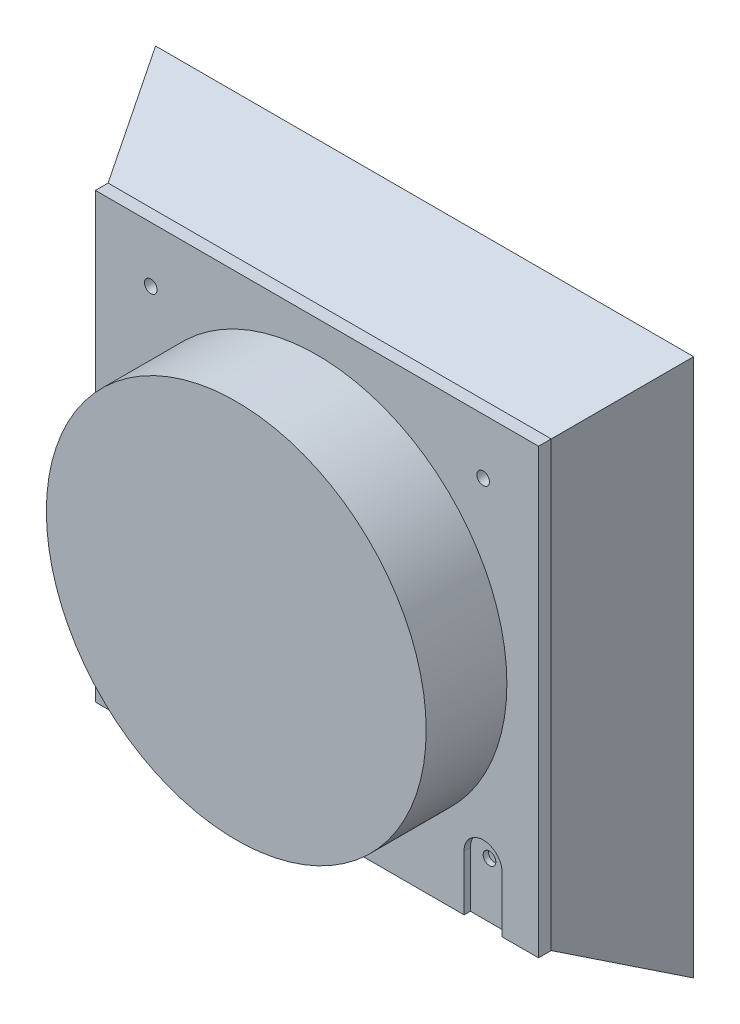
ISO-10303-21;
HEADER;
FILE_DESCRIPTION(('STEP AP214'),'2;1');
FILE_NAME('part.step','',(''),(''),'','','');
FILE_SCHEMA(('AUTOMOTIVE_DESIGN { 1 0 10303 214 1 1 1 1 }'));
ENDSEC;
DATA;
#1=APPLICATION_CONTEXT('core data for automotive mechanical design processes');
#2=APPLICATION_PROTOCOL_DEFINITION('international standard','automotive_design',2000,#1);
#3=PRODUCT_CONTEXT('',#1,'mechanical');
#4=PRODUCT('Part','Part','',(#3));
#5=PRODUCT_RELATED_PRODUCT_CATEGORY('part','',(#4));
#6=PRODUCT_DEFINITION_FORMATION('','',#4);
#7=PRODUCT_DEFINITION_CONTEXT('part definition',#1,'design');
#8=PRODUCT_DEFINITION('design','',#6,#7);
#9=PRODUCT_DEFINITION_SHAPE('','',#8);
#10=(LENGTH_UNIT() NAMED_UNIT(*) SI_UNIT(.MILLI.,.METRE.));
#11=(NAMED_UNIT(*) PLANE_ANGLE_UNIT() SI_UNIT($,.RADIAN.));
#12=(NAMED_UNIT(*) SI_UNIT($,.STERADIAN.) SOLID_ANGLE_UNIT());
#13=UNCERTAINTY_MEASURE_WITH_UNIT(LENGTH_MEASURE(1.E-05),#10,'distance_accuracy_value','');
#14=(GEOMETRIC_REPRESENTATION_CONTEXT(3) GLOBAL_UNCERTAINTY_ASSIGNED_CONTEXT((#13)) GLOBAL_UNIT_ASSIGNED_CONTEXT((#10,
#11,#12)) REPRESENTATION_CONTEXT('',''));
#15=CARTESIAN_POINT('',(0.,0.,0.));
#16=DIRECTION('',(0.,0.,1.));
#17=DIRECTION('',(1.,0.,0.));
#18=AXIS2_PLACEMENT_3D('',#15,#16,#17);
#19=CARTESIAN_POINT('',(0.,0.,29.5));
#20=DIRECTION('',(0.,0.,-1.));
#21=DIRECTION('',(-1.,0.,0.));
#22=AXIS2_PLACEMENT_3D('',#19,#20,#21);
#23=CYLINDRICAL_SURFACE('',#22,60.);
#24=CARTESIAN_POINT('',(0.,0.,29.5));
#25=DIRECTION('',(0.,0.,1.));
#26=DIRECTION('',(1.,0.,0.));
#27=AXIS2_PLACEMENT_3D('',#24,#25,#26);
#28=CIRCLE('',#27,60.);
#29=CARTESIAN_POINT('',(60.,0.,29.5));
#30=VERTEX_POINT('',#29);
#31=EDGE_CURVE('E12',#30,#30,#28,.T.);
#32=ORIENTED_EDGE('',*,*,#31,.F.);
#33=EDGE_LOOP('',(#32));
#34=FACE_BOUND('',#33,.T.);
#35=CARTESIAN_POINT('',(0.,0.,4.));
#36=DIRECTION('',(0.,0.,1.));
#37=DIRECTION('',(1.,0.,0.));
#38=AXIS2_PLACEMENT_3D('',#35,#36,#37);
#39=CIRCLE('',#38,60.);
#40=CARTESIAN_POINT('',(60.,0.,4.));
#41=VERTEX_POINT('',#40);
#42=EDGE_CURVE('E59',#41,#41,#39,.T.);
#43=ORIENTED_EDGE('',*,*,#42,.T.);
#44=EDGE_LOOP('',(#43));
#45=FACE_BOUND('',#44,.T.);
#46=ADVANCED_FACE('F56',(#34,#45),#23,.T.);
#47=CARTESIAN_POINT('',(0.,0.,29.5));
#48=DIRECTION('',(0.,0.,1.));
#49=DIRECTION('',(1.,0.,0.));
#50=AXIS2_PLACEMENT_3D('',#47,#48,#49);
#51=PLANE('',#50);
#52=ORIENTED_EDGE('',*,*,#31,.T.);
#53=EDGE_LOOP('',(#52));
#54=FACE_BOUND('',#53,.T.);
#55=ADVANCED_FACE('F71',(#54),#51,.T.);
#56=CARTESIAN_POINT('',(0.,0.,4.));
#57=DIRECTION('',(0.,0.,1.));
#58=DIRECTION('',(1.,0.,0.));
#59=AXIS2_PLACEMENT_3D('',#56,#57,#58);
#60=PLANE('',#59);
#61=ORIENTED_EDGE('',*,*,#42,.F.);
#62=EDGE_LOOP('',(#61));
#63=FACE_BOUND('',#62,.T.);
#64=ADVANCED_FACE('F69',(#63),#60,.F.);
#65=CLOSED_SHELL('',(#46,#55,#64));
#66=MANIFOLD_SOLID_BREP('B2_NOT_SHOWN',#65);
#67=CARTESIAN_POINT('',(-52.5,-52.5,4.));
#68=DIRECTION('',(0.,0.,-1.));
#69=DIRECTION('',(-1.,0.,0.));
#70=AXIS2_PLACEMENT_3D('',#67,#68,#69);
#71=CYLINDRICAL_SURFACE('',#70,1.99999999999993);
#72=CARTESIAN_POINT('',(-52.5,-52.5,2.));
#73=DIRECTION('',(0.,0.,1.));
#74=DIRECTION('',(1.,0.,0.));
#75=AXIS2_PLACEMENT_3D('',#72,#73,#74);
#76=CIRCLE('',#75,1.99999999999993);
#77=CARTESIAN_POINT('',(-50.5000000000001,-52.5,2.));
#78=VERTEX_POINT('',#77);
#79=EDGE_CURVE('E514',#78,#78,#76,.T.);
#80=ORIENTED_EDGE('',*,*,#79,.T.);
#81=EDGE_LOOP('',(#80));
#82=FACE_BOUND('',#81,.T.);
#83=CARTESIAN_POINT('',(-52.5,-52.5,0.333333333333333));
#84=DIRECTION('',(0.,0.,-1.));
#85=DIRECTION('',(-1.,0.,0.));
#86=AXIS2_PLACEMENT_3D('',#83,#84,#85);
#87=CIRCLE('',#86,1.99999999999993);
#88=CARTESIAN_POINT('',(-54.4999999999999,-52.5,0.333333333333333));
#89=VERTEX_POINT('',#88);
#90=EDGE_CURVE('E101',#89,#89,#87,.T.);
#91=ORIENTED_EDGE('',*,*,#90,.T.);
#92=EDGE_LOOP('',(#91));
#93=FACE_BOUND('',#92,.T.);
#94=ADVANCED_FACE('F97',(#82,#93),#71,.F.);
#95=CARTESIAN_POINT('',(52.5,52.5,4.));
#96=DIRECTION('',(0.,0.,-1.));
#97=DIRECTION('',(-1.,0.,0.));
#98=AXIS2_PLACEMENT_3D('',#95,#96,#97);
#99=CYLINDRICAL_SURFACE('',#98,2.);
#100=CARTESIAN_POINT('',(52.5,52.5,4.));
#101=DIRECTION('',(0.,0.,1.));
#102=DIRECTION('',(1.,0.,0.));
#103=AXIS2_PLACEMENT_3D('',#100,#101,#102);
#104=CIRCLE('',#103,2.);
#105=CARTESIAN_POINT('',(54.5,52.5,4.));
#106=VERTEX_POINT('',#105);
#107=EDGE_CURVE('E510',#106,#106,#104,.T.);
#108=ORIENTED_EDGE('',*,*,#107,.T.);
#109=EDGE_LOOP('',(#108));
#110=FACE_BOUND('',#109,.T.);
#111=CARTESIAN_POINT('',(52.5,52.5,0.333333333333333));
#112=DIRECTION('',(0.,0.,-1.));
#113=DIRECTION('',(-1.,0.,0.));
#114=AXIS2_PLACEMENT_3D('',#111,#112,#113);
#115=CIRCLE('',#114,2.);
#116=CARTESIAN_POINT('',(50.5,52.5,0.333333333333333));
#117=VERTEX_POINT('',#116);
#118=EDGE_CURVE('E525',#117,#117,#115,.T.);
#119=ORIENTED_EDGE('',*,*,#118,.T.);
#120=EDGE_LOOP('',(#119));
#121=FACE_BOUND('',#120,.T.);
#122=ADVANCED_FACE('F618',(#110,#121),#99,.F.);
#123=CARTESIAN_POINT('',(-52.5,52.5,4.));
#124=DIRECTION('',(0.,0.,-1.));
#125=DIRECTION('',(-1.,0.,0.));
#126=AXIS2_PLACEMENT_3D('',#123,#124,#125);
#127=CYLINDRICAL_SURFACE('',#126,1.99999999999995);
#128=CARTESIAN_POINT('',(-52.5,52.5,4.));
#129=DIRECTION('',(0.,0.,1.));
#130=DIRECTION('',(-1.,0.,0.));
#131=AXIS2_PLACEMENT_3D('',#128,#129,#130);
#132=CIRCLE('',#131,1.99999999999995);
#133=CARTESIAN_POINT('',(-54.5,52.5,4.));
#134=VERTEX_POINT('',#133);
#135=EDGE_CURVE('E397',#134,#134,#132,.T.);
#136=ORIENTED_EDGE('',*,*,#135,.T.);
#137=EDGE_LOOP('',(#136));
#138=FACE_BOUND('',#137,.T.);
#139=CARTESIAN_POINT('',(-52.5,52.5,0.333333333333333));
#140=DIRECTION('',(0.,0.,-1.));
#141=DIRECTION('',(-1.,0.,0.));
#142=AXIS2_PLACEMENT_3D('',#139,#140,#141);
#143=CIRCLE('',#142,1.99999999999995);
#144=CARTESIAN_POINT('',(-54.5,52.5,0.333333333333333));
#145=VERTEX_POINT('',#144);
#146=EDGE_CURVE('E522',#145,#145,#143,.T.);
#147=ORIENTED_EDGE('',*,*,#146,.T.);
#148=EDGE_LOOP('',(#147));
#149=FACE_BOUND('',#148,.T.);
#150=ADVANCED_FACE('F603',(#138,#149),#127,.F.);
#151=CARTESIAN_POINT('',(52.5,-52.5,4.));
#152=DIRECTION('',(0.,0.,-1.));
#153=DIRECTION('',(-1.,0.,0.));
#154=AXIS2_PLACEMENT_3D('',#151,#152,#153);
#155=CYLINDRICAL_SURFACE('',#154,1.99999999999999);
#156=CARTESIAN_POINT('',(52.5,-52.5,2.));
#157=DIRECTION('',(0.,0.,-1.));
#158=DIRECTION('',(-1.,0.,0.));
#159=AXIS2_PLACEMENT_3D('',#156,#157,#158);
#160=CIRCLE('',#159,1.99999999999999);
#161=CARTESIAN_POINT('',(50.5,-52.5,2.));
#162=VERTEX_POINT('',#161);
#163=EDGE_CURVE('E341',#162,#162,#160,.T.);
#164=ORIENTED_EDGE('',*,*,#163,.F.);
#165=EDGE_LOOP('',(#164));
#166=FACE_BOUND('',#165,.T.);
#167=CARTESIAN_POINT('',(52.5,-52.5,0.333333333333333));
#168=DIRECTION('',(0.,0.,-1.));
#169=DIRECTION('',(-1.,0.,0.));
#170=AXIS2_PLACEMENT_3D('',#167,#168,#169);
#171=CIRCLE('',#170,1.99999999999999);
#172=CARTESIAN_POINT('',(50.5,-52.5,0.333333333333333));
#173=VERTEX_POINT('',#172);
#174=EDGE_CURVE('E519',#173,#173,#171,.T.);
#175=ORIENTED_EDGE('',*,*,#174,.T.);
#176=EDGE_LOOP('',(#175));
#177=FACE_BOUND('',#176,.T.);
#178=ADVANCED_FACE('F444',(#166,#177),#155,.F.);
#179=CARTESIAN_POINT('',(0.,0.,-30.));
#180=DIRECTION('',(0.,0.,-1.));
#181=DIRECTION('',(-1.,0.,0.));
#182=AXIS2_PLACEMENT_3D('',#179,#180,#181);
#183=PLANE('',#182);
#184=DIRECTION('',(0.,1.,0.));
#185=VECTOR('',#184,1.);
#186=CARTESIAN_POINT('',(-85.,-85.,-30.));
#187=LINE('',#186,#185);
#188=CARTESIAN_POINT('',(-85.,-85.,-30.));
#189=VERTEX_POINT('',#188);
#190=CARTESIAN_POINT('',(-85.,85.0000000000001,-30.));
#191=VERTEX_POINT('',#190);
#192=EDGE_CURVE('E350',#189,#191,#187,.T.);
#193=ORIENTED_EDGE('',*,*,#192,.T.);
#194=DIRECTION('',(1.,0.,0.));
#195=VECTOR('',#194,1.);
#196=CARTESIAN_POINT('',(-85.,85.,-30.));
#197=LINE('',#196,#195);
#198=CARTESIAN_POINT('',(85.,85.,-30.));
#199=VERTEX_POINT('',#198);
#200=EDGE_CURVE('E405',#191,#199,#197,.T.);
#201=ORIENTED_EDGE('',*,*,#200,.T.);
#202=DIRECTION('',(0.,1.,0.));
#203=VECTOR('',#202,1.);
#204=CARTESIAN_POINT('',(85.,-85.,-30.));
#205=LINE('',#204,#203);
#206=CARTESIAN_POINT('',(85.,-85.,-30.));
#207=VERTEX_POINT('',#206);
#208=EDGE_CURVE('E474',#207,#199,#205,.T.);
#209=ORIENTED_EDGE('',*,*,#208,.F.);
#210=DIRECTION('',(1.,0.,0.));
#211=VECTOR('',#210,1.);
#212=CARTESIAN_POINT('',(-85.,-85.,-30.));
#213=LINE('',#212,#211);
#214=EDGE_CURVE('E356',#189,#207,#213,.T.);
#215=ORIENTED_EDGE('',*,*,#214,.F.);
#216=EDGE_LOOP('',(#193,#201,#209,#215));
#217=FACE_BOUND('',#216,.T.);
#218=DIRECTION('',(1.,0.,0.));
#219=VECTOR('',#218,1.);
#220=CARTESIAN_POINT('',(0.,80.5278640450005,-30.));
#221=LINE('',#220,#219);
#222=CARTESIAN_POINT('',(-80.5278640450004,80.5278640450005,-30.));
#223=VERTEX_POINT('',#222);
#224=CARTESIAN_POINT('',(80.5278640450004,80.5278640450005,-30.));
#225=VERTEX_POINT('',#224);
#226=EDGE_CURVE('E340',#223,#225,#221,.T.);
#227=ORIENTED_EDGE('',*,*,#226,.F.);
#228=DIRECTION('',(0.,1.,0.));
#229=VECTOR('',#228,1.);
#230=CARTESIAN_POINT('',(-80.5278640450004,0.,-30.));
#231=LINE('',#230,#229);
#232=CARTESIAN_POINT('',(-80.5278640450004,-80.5278640450005,-30.));
#233=VERTEX_POINT('',#232);
#234=EDGE_CURVE('E337',#233,#223,#231,.T.);
#235=ORIENTED_EDGE('',*,*,#234,.F.);
#236=DIRECTION('',(1.,0.,0.));
#237=VECTOR('',#236,1.);
#238=CARTESIAN_POINT('',(0.,-80.5278640450005,-30.));
#239=LINE('',#238,#237);
#240=CARTESIAN_POINT('',(80.5278640450004,-80.5278640450005,-30.));
#241=VERTEX_POINT('',#240);
#242=EDGE_CURVE('E331',#233,#241,#239,.T.);
#243=ORIENTED_EDGE('',*,*,#242,.T.);
#244=DIRECTION('',(0.,1.,0.));
#245=VECTOR('',#244,1.);
#246=CARTESIAN_POINT('',(80.5278640450004,0.,-30.));
#247=LINE('',#246,#245);
#248=EDGE_CURVE('E343',#241,#225,#247,.T.);
#249=ORIENTED_EDGE('',*,*,#248,.T.);
#250=EDGE_LOOP('',(#227,#235,#243,#249));
#251=FACE_BOUND('',#250,.T.);
#252=ADVANCED_FACE('F439',(#217,#251),#183,.T.);
#253=CARTESIAN_POINT('',(0.,0.,4.));
#254=DIRECTION('',(0.,0.,-1.));
#255=DIRECTION('',(-1.,0.,0.));
#256=AXIS2_PLACEMENT_3D('',#253,#254,#255);
#257=PLANE('',#256);
#258=DIRECTION('',(1.,0.,0.));
#259=VECTOR('',#258,1.);
#260=CARTESIAN_POINT('',(-70.,-70.,4.));
#261=LINE('',#260,#259);
#262=CARTESIAN_POINT('',(-70.,-70.,4.));
#263=VERTEX_POINT('',#262);
#264=CARTESIAN_POINT('',(-58.525,-70.,4.));
#265=VERTEX_POINT('',#264);
#266=EDGE_CURVE('E501',#263,#265,#261,.T.);
#267=ORIENTED_EDGE('',*,*,#266,.T.);
#268=DIRECTION('',(0.,-1.,0.));
#269=VECTOR('',#268,1.);
#270=CARTESIAN_POINT('',(-58.525,-70.,4.));
#271=LINE('',#270,#269);
#272=CARTESIAN_POINT('',(-58.525,-52.5,4.));
#273=VERTEX_POINT('',#272);
#274=EDGE_CURVE('E285',#273,#265,#271,.T.);
#275=ORIENTED_EDGE('',*,*,#274,.F.);
#276=CARTESIAN_POINT('',(-52.5,-52.5,4.));
#277=DIRECTION('',(0.,0.,1.));
#278=DIRECTION('',(1.,0.,0.));
#279=AXIS2_PLACEMENT_3D('',#276,#277,#278);
#280=CIRCLE('',#279,6.025);
#281=CARTESIAN_POINT('',(-46.475,-52.5,4.));
#282=VERTEX_POINT('',#281);
#283=EDGE_CURVE('E562',#282,#273,#280,.T.);
#284=ORIENTED_EDGE('',*,*,#283,.F.);
#285=DIRECTION('',(0.,1.,0.));
#286=VECTOR('',#285,1.);
#287=CARTESIAN_POINT('',(-46.475,-70.,4.));
#288=LINE('',#287,#286);
#289=CARTESIAN_POINT('',(-46.475,-70.,4.));
#290=VERTEX_POINT('',#289);
#291=EDGE_CURVE('E566',#290,#282,#288,.T.);
#292=ORIENTED_EDGE('',*,*,#291,.F.);
#293=CARTESIAN_POINT('',(46.475,-70.,4.));
#294=VERTEX_POINT('',#293);
#295=EDGE_CURVE('E259',#290,#294,#261,.T.);
#296=ORIENTED_EDGE('',*,*,#295,.T.);
#297=DIRECTION('',(0.,-1.,0.));
#298=VECTOR('',#297,1.);
#299=CARTESIAN_POINT('',(46.475,-70.,4.));
#300=LINE('',#299,#298);
#301=CARTESIAN_POINT('',(46.475,-52.5,4.));
#302=VERTEX_POINT('',#301);
#303=EDGE_CURVE('E276',#302,#294,#300,.T.);
#304=ORIENTED_EDGE('',*,*,#303,.F.);
#305=CARTESIAN_POINT('',(52.5,-52.5,4.));
#306=DIRECTION('',(0.,0.,1.));
#307=DIRECTION('',(-1.,0.,0.));
#308=AXIS2_PLACEMENT_3D('',#305,#306,#307);
#309=CIRCLE('',#308,6.025);
#310=CARTESIAN_POINT('',(58.525,-52.5,4.));
#311=VERTEX_POINT('',#310);
#312=EDGE_CURVE('E278',#311,#302,#309,.T.);
#313=ORIENTED_EDGE('',*,*,#312,.F.);
#314=DIRECTION('',(0.,1.,0.));
#315=VECTOR('',#314,1.);
#316=CARTESIAN_POINT('',(58.525,-70.,4.));
#317=LINE('',#316,#315);
#318=CARTESIAN_POINT('',(58.525,-70.,4.));
#319=VERTEX_POINT('',#318);
#320=EDGE_CURVE('E282',#319,#311,#317,.T.);
#321=ORIENTED_EDGE('',*,*,#320,.F.);
#322=CARTESIAN_POINT('',(70.,-70.,4.));
#323=VERTEX_POINT('',#322);
#324=EDGE_CURVE('E579',#319,#323,#261,.T.);
#325=ORIENTED_EDGE('',*,*,#324,.T.);
#326=DIRECTION('',(0.,1.,0.));
#327=VECTOR('',#326,1.);
#328=CARTESIAN_POINT('',(70.,-70.,4.));
#329=LINE('',#328,#327);
#330=CARTESIAN_POINT('',(70.,70.,4.));
#331=VERTEX_POINT('',#330);
#332=EDGE_CURVE('E513',#323,#331,#329,.T.);
#333=ORIENTED_EDGE('',*,*,#332,.T.);
#334=DIRECTION('',(-1.,0.,0.));
#335=VECTOR('',#334,1.);
#336=CARTESIAN_POINT('',(-70.,70.,4.));
#337=LINE('',#336,#335);
#338=CARTESIAN_POINT('',(-70.,70.,4.));
#339=VERTEX_POINT('',#338);
#340=EDGE_CURVE('E584',#331,#339,#337,.T.);
#341=ORIENTED_EDGE('',*,*,#340,.T.);
#342=DIRECTION('',(0.,-1.,0.));
#343=VECTOR('',#342,1.);
#344=CARTESIAN_POINT('',(-70.,-70.,4.));
#345=LINE('',#344,#343);
#346=EDGE_CURVE('E577',#339,#263,#345,.T.);
#347=ORIENTED_EDGE('',*,*,#346,.T.);
#348=EDGE_LOOP('',(#267,#275,#284,#292,#296,#304,#313,#321,#325,#333,#341,#347));
#349=FACE_BOUND('',#348,.T.);
#350=ORIENTED_EDGE('',*,*,#107,.F.);
#351=EDGE_LOOP('',(#350));
#352=FACE_BOUND('',#351,.T.);
#353=CARTESIAN_POINT('',(0.,0.,4.));
#354=DIRECTION('',(0.,0.,1.));
#355=DIRECTION('',(1.,0.,0.));
#356=AXIS2_PLACEMENT_3D('',#353,#354,#355);
#357=CIRCLE('',#356,59.);
#358=CARTESIAN_POINT('',(59.,0.,4.));
#359=VERTEX_POINT('',#358);
#360=EDGE_CURVE('E590',#359,#359,#357,.T.);
#361=ORIENTED_EDGE('',*,*,#360,.F.);
#362=EDGE_LOOP('',(#361));
#363=FACE_BOUND('',#362,.T.);
#364=ORIENTED_EDGE('',*,*,#135,.F.);
#365=EDGE_LOOP('',(#364));
#366=FACE_BOUND('',#365,.T.);
#367=ADVANCED_FACE('F443',(#349,#352,#363,#366),#257,.F.);
#368=CARTESIAN_POINT('',(70.,-70.,4.));
#369=DIRECTION('',(-1.,0.,0.));
#370=DIRECTION('',(0.,0.,1.));
#371=AXIS2_PLACEMENT_3D('',#368,#369,#370);
#372=PLANE('',#371);
#373=DIRECTION('',(0.,1.,0.));
#374=VECTOR('',#373,1.);
#375=CARTESIAN_POINT('',(70.,-70.,0.));
#376=LINE('',#375,#374);
#377=CARTESIAN_POINT('',(70.,-70.,0.));
#378=VERTEX_POINT('',#377);
#379=CARTESIAN_POINT('',(70.,70.,0.));
#380=VERTEX_POINT('',#379);
#381=EDGE_CURVE('E507',#378,#380,#376,.T.);
#382=ORIENTED_EDGE('',*,*,#381,.T.);
#383=DIRECTION('',(0.,0.,-1.));
#384=VECTOR('',#383,1.);
#385=CARTESIAN_POINT('',(70.,70.,4.));
#386=LINE('',#385,#384);
#387=EDGE_CURVE('E54',#331,#380,#386,.T.);
#388=ORIENTED_EDGE('',*,*,#387,.F.);
#389=ORIENTED_EDGE('',*,*,#332,.F.);
#390=DIRECTION('',(0.,0.,-1.));
#391=VECTOR('',#390,1.);
#392=CARTESIAN_POINT('',(70.,-70.,4.));
#393=LINE('',#392,#391);
#394=EDGE_CURVE('E502',#323,#378,#393,.T.);
#395=ORIENTED_EDGE('',*,*,#394,.T.);
#396=EDGE_LOOP('',(#382,#388,#389,#395));
#397=FACE_BOUND('',#396,.T.);
#398=ADVANCED_FACE('F99',(#397),#372,.F.);
#399=CARTESIAN_POINT('',(-70.,70.,4.));
#400=DIRECTION('',(0.,-1.,0.));
#401=DIRECTION('',(0.,0.,-1.));
#402=AXIS2_PLACEMENT_3D('',#399,#400,#401);
#403=PLANE('',#402);
#404=DIRECTION('',(1.,0.,0.));
#405=VECTOR('',#404,1.);
#406=CARTESIAN_POINT('',(-70.,70.,0.));
#407=LINE('',#406,#405);
#408=CARTESIAN_POINT('',(-70.,70.,0.));
#409=VERTEX_POINT('',#408);
#410=EDGE_CURVE('E495',#380,#409,#407,.F.);
#411=ORIENTED_EDGE('',*,*,#410,.T.);
#412=DIRECTION('',(0.,0.,-1.));
#413=VECTOR('',#412,1.);
#414=CARTESIAN_POINT('',(-70.,70.,4.));
#415=LINE('',#414,#413);
#416=EDGE_CURVE('E106',#339,#409,#415,.T.);
#417=ORIENTED_EDGE('',*,*,#416,.F.);
#418=ORIENTED_EDGE('',*,*,#340,.F.);
#419=ORIENTED_EDGE('',*,*,#387,.T.);
#420=EDGE_LOOP('',(#411,#417,#418,#419));
#421=FACE_BOUND('',#420,.T.);
#422=ADVANCED_FACE('F613',(#421),#403,.F.);
#423=CARTESIAN_POINT('',(-70.,-70.,4.));
#424=DIRECTION('',(1.,0.,0.));
#425=DIRECTION('',(0.,0.,-1.));
#426=AXIS2_PLACEMENT_3D('',#423,#424,#425);
#427=PLANE('',#426);
#428=DIRECTION('',(0.,1.,0.));
#429=VECTOR('',#428,1.);
#430=CARTESIAN_POINT('',(-70.,-70.,0.));
#431=LINE('',#430,#429);
#432=CARTESIAN_POINT('',(-70.,-70.,0.));
#433=VERTEX_POINT('',#432);
#434=EDGE_CURVE('E483',#409,#433,#431,.F.);
#435=ORIENTED_EDGE('',*,*,#434,.T.);
#436=DIRECTION('',(0.,0.,-1.));
#437=VECTOR('',#436,1.);
#438=CARTESIAN_POINT('',(-70.,-70.,4.));
#439=LINE('',#438,#437);
#440=EDGE_CURVE('E491',#263,#433,#439,.T.);
#441=ORIENTED_EDGE('',*,*,#440,.F.);
#442=ORIENTED_EDGE('',*,*,#346,.F.);
#443=ORIENTED_EDGE('',*,*,#416,.T.);
#444=EDGE_LOOP('',(#435,#441,#442,#443));
#445=FACE_BOUND('',#444,.T.);
#446=ADVANCED_FACE('F489',(#445),#427,.F.);
#447=CARTESIAN_POINT('',(-70.,-70.,4.));
#448=DIRECTION('',(0.,1.,0.));
#449=DIRECTION('',(0.,0.,1.));
#450=AXIS2_PLACEMENT_3D('',#447,#448,#449);
#451=PLANE('',#450);
#452=DIRECTION('',(1.,0.,0.));
#453=VECTOR('',#452,1.);
#454=CARTESIAN_POINT('',(-58.525,-70.,2.));
#455=LINE('',#454,#453);
#456=CARTESIAN_POINT('',(-58.525,-70.,2.));
#457=VERTEX_POINT('',#456);
#458=CARTESIAN_POINT('',(-46.475,-70.,2.));
#459=VERTEX_POINT('',#458);
#460=EDGE_CURVE('E248',#457,#459,#455,.T.);
#461=ORIENTED_EDGE('',*,*,#460,.F.);
#462=DIRECTION('',(0.,0.,1.));
#463=VECTOR('',#462,1.);
#464=CARTESIAN_POINT('',(-58.525,-70.,2.));
#465=LINE('',#464,#463);
#466=EDGE_CURVE('E260',#457,#265,#465,.T.);
#467=ORIENTED_EDGE('',*,*,#466,.T.);
#468=ORIENTED_EDGE('',*,*,#266,.F.);
#469=ORIENTED_EDGE('',*,*,#440,.T.);
#470=DIRECTION('',(1.,0.,0.));
#471=VECTOR('',#470,1.);
#472=CARTESIAN_POINT('',(-70.,-70.,0.));
#473=LINE('',#472,#471);
#474=EDGE_CURVE('E494',#433,#378,#473,.T.);
#475=ORIENTED_EDGE('',*,*,#474,.T.);
#476=ORIENTED_EDGE('',*,*,#394,.F.);
#477=ORIENTED_EDGE('',*,*,#324,.F.);
#478=DIRECTION('',(0.,0.,1.));
#479=VECTOR('',#478,1.);
#480=CARTESIAN_POINT('',(58.525,-70.,2.));
#481=LINE('',#480,#479);
#482=CARTESIAN_POINT('',(58.525,-70.,2.));
#483=VERTEX_POINT('',#482);
#484=EDGE_CURVE('E274',#483,#319,#481,.T.);
#485=ORIENTED_EDGE('',*,*,#484,.F.);
#486=DIRECTION('',(1.,0.,0.));
#487=VECTOR('',#486,1.);
#488=CARTESIAN_POINT('',(58.525,-70.,2.));
#489=LINE('',#488,#487);
#490=CARTESIAN_POINT('',(46.475,-70.,2.));
#491=VERTEX_POINT('',#490);
#492=EDGE_CURVE('E269',#491,#483,#489,.T.);
#493=ORIENTED_EDGE('',*,*,#492,.F.);
#494=DIRECTION('',(0.,0.,1.));
#495=VECTOR('',#494,1.);
#496=CARTESIAN_POINT('',(46.475,-70.,2.));
#497=LINE('',#496,#495);
#498=EDGE_CURVE('E272',#491,#294,#497,.T.);
#499=ORIENTED_EDGE('',*,*,#498,.T.);
#500=ORIENTED_EDGE('',*,*,#295,.F.);
#501=DIRECTION('',(0.,0.,1.));
#502=VECTOR('',#501,1.);
#503=CARTESIAN_POINT('',(-46.475,-70.,2.));
#504=LINE('',#503,#502);
#505=EDGE_CURVE('E243',#459,#290,#504,.T.);
#506=ORIENTED_EDGE('',*,*,#505,.F.);
#507=EDGE_LOOP('',(#461,#467,#468,#469,#475,#476,#477,#485,#493,#499,#500,#506));
#508=FACE_BOUND('',#507,.T.);
#509=ADVANCED_FACE('F256',(#508),#451,.F.);
#510=CARTESIAN_POINT('',(0.,0.,4.));
#511=DIRECTION('',(0.,0.,-1.));
#512=DIRECTION('',(-1.,0.,0.));
#513=AXIS2_PLACEMENT_3D('',#510,#511,#512);
#514=CYLINDRICAL_SURFACE('',#513,59.);
#515=ORIENTED_EDGE('',*,*,#360,.T.);
#516=EDGE_LOOP('',(#515));
#517=FACE_BOUND('',#516,.T.);
#518=CARTESIAN_POINT('',(0.,0.,0.));
#519=DIRECTION('',(0.,0.,-1.));
#520=DIRECTION('',(-1.,0.,0.));
#521=AXIS2_PLACEMENT_3D('',#518,#519,#520);
#522=CIRCLE('',#521,59.);
#523=CARTESIAN_POINT('',(-59.,0.,0.));
#524=VERTEX_POINT('',#523);
#525=EDGE_CURVE('E311',#524,#524,#522,.T.);
#526=ORIENTED_EDGE('',*,*,#525,.T.);
#527=EDGE_LOOP('',(#526));
#528=FACE_BOUND('',#527,.T.);
#529=ADVANCED_FACE('F438',(#517,#528),#514,.F.);
#530=CARTESIAN_POINT('',(-55.9999999999999,0.,28.));
#531=DIRECTION('',(0.894427190999916,0.,-0.447213595499959));
#532=DIRECTION('',(-0.447213595499959,0.,-0.894427190999916));
#533=AXIS2_PLACEMENT_3D('',#530,#531,#532);
#534=PLANE('',#533);
#535=DIRECTION('',(0.408248290463864,0.408248290463862,0.816496580927726));
#536=VECTOR('',#535,1.);
#537=CARTESIAN_POINT('',(-85.,-85.,-30.));
#538=LINE('',#537,#536);
#539=EDGE_CURVE('E362',#189,#433,#538,.T.);
#540=ORIENTED_EDGE('',*,*,#539,.T.);
#541=ORIENTED_EDGE('',*,*,#434,.F.);
#542=DIRECTION('',(0.408248290463863,-0.408248290463864,0.816496580927725));
#543=VECTOR('',#542,1.);
#544=CARTESIAN_POINT('',(-85.,85.,-30.));
#545=LINE('',#544,#543);
#546=EDGE_CURVE('E410',#191,#409,#545,.T.);
#547=ORIENTED_EDGE('',*,*,#546,.F.);
#548=ORIENTED_EDGE('',*,*,#192,.F.);
#549=EDGE_LOOP('',(#540,#541,#547,#548));
#550=FACE_BOUND('',#549,.T.);
#551=ADVANCED_FACE('F429',(#550),#534,.F.);
#552=CARTESIAN_POINT('',(0.,55.9999999999999,28.));
#553=DIRECTION('',(0.,-0.894427190999915,-0.447213595499959));
#554=DIRECTION('',(0.,0.447213595499959,-0.894427190999916));
#555=AXIS2_PLACEMENT_3D('',#552,#553,#554);
#556=PLANE('',#555);
#557=ORIENTED_EDGE('',*,*,#546,.T.);
#558=ORIENTED_EDGE('',*,*,#410,.F.);
#559=DIRECTION('',(-0.408248290463862,-0.408248290463863,0.816496580927726));
#560=VECTOR('',#559,1.);
#561=CARTESIAN_POINT('',(85.,85.,-30.));
#562=LINE('',#561,#560);
#563=EDGE_CURVE('E390',#199,#380,#562,.T.);
#564=ORIENTED_EDGE('',*,*,#563,.F.);
#565=ORIENTED_EDGE('',*,*,#200,.F.);
#566=EDGE_LOOP('',(#557,#558,#564,#565));
#567=FACE_BOUND('',#566,.T.);
#568=ADVANCED_FACE('F375',(#567),#556,.F.);
#569=CARTESIAN_POINT('',(0.,-56.,28.));
#570=DIRECTION('',(0.,-0.894427190999916,0.447213595499958));
#571=DIRECTION('',(0.,-0.447213595499958,-0.894427190999916));
#572=AXIS2_PLACEMENT_3D('',#569,#570,#571);
#573=PLANE('',#572);
#574=DIRECTION('',(-0.408248290463863,0.408248290463863,0.816496580927726));
#575=VECTOR('',#574,1.);
#576=CARTESIAN_POINT('',(85.,-85.,-30.));
#577=LINE('',#576,#575);
#578=EDGE_CURVE('E398',#207,#378,#577,.T.);
#579=ORIENTED_EDGE('',*,*,#578,.T.);
#580=ORIENTED_EDGE('',*,*,#474,.F.);
#581=ORIENTED_EDGE('',*,*,#539,.F.);
#582=ORIENTED_EDGE('',*,*,#214,.T.);
#583=EDGE_LOOP('',(#579,#580,#581,#582));
#584=FACE_BOUND('',#583,.T.);
#585=ADVANCED_FACE('F364',(#584),#573,.T.);
#586=CARTESIAN_POINT('',(56.0000000000001,0.,28.));
#587=DIRECTION('',(0.894427190999916,0.,0.447213595499957));
#588=DIRECTION('',(0.447213595499957,0.,-0.894427190999916));
#589=AXIS2_PLACEMENT_3D('',#586,#587,#588);
#590=PLANE('',#589);
#591=ORIENTED_EDGE('',*,*,#563,.T.);
#592=ORIENTED_EDGE('',*,*,#381,.F.);
#593=ORIENTED_EDGE('',*,*,#578,.F.);
#594=ORIENTED_EDGE('',*,*,#208,.T.);
#595=EDGE_LOOP('',(#591,#592,#593,#594));
#596=FACE_BOUND('',#595,.T.);
#597=ADVANCED_FACE('F374',(#596),#590,.T.);
#598=CARTESIAN_POINT('',(0.,0.,0.));
#599=DIRECTION('',(0.,0.,-1.));
#600=DIRECTION('',(-1.,0.,0.));
#601=AXIS2_PLACEMENT_3D('',#598,#599,#600);
#602=PLANE('',#601);
#603=CARTESIAN_POINT('',(52.5,-52.5,0.));
#604=DIRECTION('',(0.,0.,-1.));
#605=DIRECTION('',(-1.,0.,0.));
#606=AXIS2_PLACEMENT_3D('',#603,#604,#605);
#607=CIRCLE('',#606,3.89999999999998);
#608=CARTESIAN_POINT('',(48.6,-52.5,0.));
#609=VERTEX_POINT('',#608);
#610=EDGE_CURVE('E544',#609,#609,#607,.T.);
#611=ORIENTED_EDGE('',*,*,#610,.F.);
#612=EDGE_LOOP('',(#611));
#613=FACE_BOUND('',#612,.T.);
#614=CARTESIAN_POINT('',(-52.5,-52.5,0.));
#615=DIRECTION('',(0.,0.,-1.));
#616=DIRECTION('',(-1.,0.,0.));
#617=AXIS2_PLACEMENT_3D('',#614,#615,#616);
#618=CIRCLE('',#617,3.89999999999993);
#619=CARTESIAN_POINT('',(-56.3999999999999,-52.5,0.));
#620=VERTEX_POINT('',#619);
#621=EDGE_CURVE('E543',#620,#620,#618,.T.);
#622=ORIENTED_EDGE('',*,*,#621,.F.);
#623=EDGE_LOOP('',(#622));
#624=FACE_BOUND('',#623,.T.);
#625=CARTESIAN_POINT('',(-52.5,52.5,0.));
#626=DIRECTION('',(0.,0.,-1.));
#627=DIRECTION('',(-1.,0.,0.));
#628=AXIS2_PLACEMENT_3D('',#625,#626,#627);
#629=CIRCLE('',#628,3.89999999999995);
#630=CARTESIAN_POINT('',(-56.4,52.5,0.));
#631=VERTEX_POINT('',#630);
#632=EDGE_CURVE('E561',#631,#631,#629,.T.);
#633=ORIENTED_EDGE('',*,*,#632,.F.);
#634=EDGE_LOOP('',(#633));
#635=FACE_BOUND('',#634,.T.);
#636=CARTESIAN_POINT('',(52.5,52.5,0.));
#637=DIRECTION('',(0.,0.,-1.));
#638=DIRECTION('',(-1.,0.,0.));
#639=AXIS2_PLACEMENT_3D('',#636,#637,#638);
#640=CIRCLE('',#639,3.9);
#641=CARTESIAN_POINT('',(48.6,52.5,0.));
#642=VERTEX_POINT('',#641);
#643=EDGE_CURVE('E558',#642,#642,#640,.T.);
#644=ORIENTED_EDGE('',*,*,#643,.F.);
#645=EDGE_LOOP('',(#644));
#646=FACE_BOUND('',#645,.T.);
#647=ORIENTED_EDGE('',*,*,#525,.F.);
#648=EDGE_LOOP('',(#647));
#649=FACE_BOUND('',#648,.T.);
#650=DIRECTION('',(0.,1.,0.));
#651=VECTOR('',#650,1.);
#652=CARTESIAN_POINT('',(66.,0.,0.));
#653=LINE('',#652,#651);
#654=CARTESIAN_POINT('',(66.,-66.,0.));
#655=VERTEX_POINT('',#654);
#656=CARTESIAN_POINT('',(66.,66.,0.));
#657=VERTEX_POINT('',#656);
#658=EDGE_CURVE('E292',#655,#657,#653,.T.);
#659=ORIENTED_EDGE('',*,*,#658,.F.);
#660=DIRECTION('',(1.,0.,0.));
#661=VECTOR('',#660,1.);
#662=CARTESIAN_POINT('',(0.,-66.,0.));
#663=LINE('',#662,#661);
#664=CARTESIAN_POINT('',(-66.,-66.,0.));
#665=VERTEX_POINT('',#664);
#666=EDGE_CURVE('E300',#665,#655,#663,.T.);
#667=ORIENTED_EDGE('',*,*,#666,.F.);
#668=DIRECTION('',(0.,-1.,0.));
#669=VECTOR('',#668,1.);
#670=CARTESIAN_POINT('',(-66.,0.,0.));
#671=LINE('',#670,#669);
#672=CARTESIAN_POINT('',(-66.,66.,0.));
#673=VERTEX_POINT('',#672);
#674=EDGE_CURVE('E298',#673,#665,#671,.T.);
#675=ORIENTED_EDGE('',*,*,#674,.F.);
#676=DIRECTION('',(-1.,0.,0.));
#677=VECTOR('',#676,1.);
#678=CARTESIAN_POINT('',(0.,66.,0.));
#679=LINE('',#678,#677);
#680=EDGE_CURVE('E295',#657,#673,#679,.T.);
#681=ORIENTED_EDGE('',*,*,#680,.F.);
#682=EDGE_LOOP('',(#659,#667,#675,#681));
#683=FACE_BOUND('',#682,.T.);
#684=ADVANCED_FACE('F381',(#613,#624,#635,#646,#649,#683),#602,.T.);
#685=CARTESIAN_POINT('',(66.,-70.,4.));
#686=DIRECTION('',(-1.,0.,0.));
#687=DIRECTION('',(0.,0.,1.));
#688=AXIS2_PLACEMENT_3D('',#685,#686,#687);
#689=PLANE('',#688);
#690=DIRECTION('',(0.,1.,0.));
#691=VECTOR('',#690,1.);
#692=CARTESIAN_POINT('',(66.,-70.,-0.944271909999169));
#693=LINE('',#692,#691);
#694=CARTESIAN_POINT('',(66.,-66.,-0.944271909999135));
#695=VERTEX_POINT('',#694);
#696=CARTESIAN_POINT('',(66.,66.,-0.94427190999917));
#697=VERTEX_POINT('',#696);
#698=EDGE_CURVE('E303',#695,#697,#693,.T.);
#699=ORIENTED_EDGE('',*,*,#698,.F.);
#700=DIRECTION('',(0.,0.,-1.));
#701=VECTOR('',#700,1.);
#702=CARTESIAN_POINT('',(66.,-66.,4.));
#703=LINE('',#702,#701);
#704=EDGE_CURVE('E302',#655,#695,#703,.T.);
#705=ORIENTED_EDGE('',*,*,#704,.F.);
#706=ORIENTED_EDGE('',*,*,#658,.T.);
#707=DIRECTION('',(0.,0.,-1.));
#708=VECTOR('',#707,1.);
#709=CARTESIAN_POINT('',(66.,66.,4.));
#710=LINE('',#709,#708);
#711=EDGE_CURVE('E308',#657,#697,#710,.T.);
#712=ORIENTED_EDGE('',*,*,#711,.T.);
#713=EDGE_LOOP('',(#699,#705,#706,#712));
#714=FACE_BOUND('',#713,.T.);
#715=ADVANCED_FACE('F658',(#714),#689,.T.);
#716=CARTESIAN_POINT('',(-70.,66.,4.));
#717=DIRECTION('',(0.,-1.,0.));
#718=DIRECTION('',(0.,0.,-1.));
#719=AXIS2_PLACEMENT_3D('',#716,#717,#718);
#720=PLANE('',#719);
#721=DIRECTION('',(-1.,0.,0.));
#722=VECTOR('',#721,1.);
#723=CARTESIAN_POINT('',(0.,66.,-0.944271909999198));
#724=LINE('',#723,#722);
#725=CARTESIAN_POINT('',(-66.,66.,-0.944271909999177));
#726=VERTEX_POINT('',#725);
#727=EDGE_CURVE('E306',#697,#726,#724,.T.);
#728=ORIENTED_EDGE('',*,*,#727,.F.);
#729=ORIENTED_EDGE('',*,*,#711,.F.);
#730=ORIENTED_EDGE('',*,*,#680,.T.);
#731=DIRECTION('',(0.,0.,-1.));
#732=VECTOR('',#731,1.);
#733=CARTESIAN_POINT('',(-66.,66.,4.));
#734=LINE('',#733,#732);
#735=EDGE_CURVE('E312',#673,#726,#734,.T.);
#736=ORIENTED_EDGE('',*,*,#735,.T.);
#737=EDGE_LOOP('',(#728,#729,#730,#736));
#738=FACE_BOUND('',#737,.T.);
#739=ADVANCED_FACE('F662',(#738),#720,.T.);
#740=CARTESIAN_POINT('',(-66.,-70.,4.));
#741=DIRECTION('',(1.,0.,0.));
#742=DIRECTION('',(0.,0.,-1.));
#743=AXIS2_PLACEMENT_3D('',#740,#741,#742);
#744=PLANE('',#743);
#745=DIRECTION('',(0.,-1.,0.));
#746=VECTOR('',#745,1.);
#747=CARTESIAN_POINT('',(-66.,0.,-0.944271909999156));
#748=LINE('',#747,#746);
#749=CARTESIAN_POINT('',(-66.,-66.,-0.944271909999136));
#750=VERTEX_POINT('',#749);
#751=EDGE_CURVE('E318',#726,#750,#748,.T.);
#752=ORIENTED_EDGE('',*,*,#751,.F.);
#753=ORIENTED_EDGE('',*,*,#735,.F.);
#754=ORIENTED_EDGE('',*,*,#674,.T.);
#755=DIRECTION('',(0.,0.,-1.));
#756=VECTOR('',#755,1.);
#757=CARTESIAN_POINT('',(-66.,-66.,4.));
#758=LINE('',#757,#756);
#759=EDGE_CURVE('E315',#665,#750,#758,.T.);
#760=ORIENTED_EDGE('',*,*,#759,.T.);
#761=EDGE_LOOP('',(#752,#753,#754,#760));
#762=FACE_BOUND('',#761,.T.);
#763=ADVANCED_FACE('F666',(#762),#744,.T.);
#764=CARTESIAN_POINT('',(-70.,-66.,4.));
#765=DIRECTION('',(0.,1.,0.));
#766=DIRECTION('',(0.,0.,1.));
#767=AXIS2_PLACEMENT_3D('',#764,#765,#766);
#768=PLANE('',#767);
#769=DIRECTION('',(1.,0.,0.));
#770=VECTOR('',#769,1.);
#771=CARTESIAN_POINT('',(-70.,-66.,-0.944271909999103));
#772=LINE('',#771,#770);
#773=EDGE_CURVE('E296',#750,#695,#772,.T.);
#774=ORIENTED_EDGE('',*,*,#773,.F.);
#775=ORIENTED_EDGE('',*,*,#759,.F.);
#776=ORIENTED_EDGE('',*,*,#666,.T.);
#777=ORIENTED_EDGE('',*,*,#704,.T.);
#778=EDGE_LOOP('',(#774,#775,#776,#777));
#779=FACE_BOUND('',#778,.T.);
#780=ADVANCED_FACE('F670',(#779),#768,.T.);
#781=CARTESIAN_POINT('',(-52.4222912360003,0.,26.2111456180002));
#782=DIRECTION('',(0.894427190999916,0.,-0.447213595499959));
#783=DIRECTION('',(-0.447213595499959,0.,-0.894427190999916));
#784=AXIS2_PLACEMENT_3D('',#781,#782,#783);
#785=PLANE('',#784);
#786=DIRECTION('',(0.408248290463864,0.408248290463863,0.816496580927726));
#787=VECTOR('',#786,1.);
#788=CARTESIAN_POINT('',(-43.6852426966669,-43.685242696667,43.685242696667));
#789=LINE('',#788,#787);
#790=EDGE_CURVE('E327',#233,#750,#789,.T.);
#791=ORIENTED_EDGE('',*,*,#790,.F.);
#792=ORIENTED_EDGE('',*,*,#234,.T.);
#793=DIRECTION('',(0.408248290463864,-0.408248290463864,0.816496580927725));
#794=VECTOR('',#793,1.);
#795=CARTESIAN_POINT('',(-43.6852426966669,43.6852426966669,43.685242696667));
#796=LINE('',#795,#794);
#797=EDGE_CURVE('E330',#223,#726,#796,.T.);
#798=ORIENTED_EDGE('',*,*,#797,.T.);
#799=ORIENTED_EDGE('',*,*,#751,.T.);
#800=EDGE_LOOP('',(#791,#792,#798,#799));
#801=FACE_BOUND('',#800,.T.);
#802=ADVANCED_FACE('F674',(#801),#785,.T.);
#803=CARTESIAN_POINT('',(0.,52.4222912360003,26.2111456180002));
#804=DIRECTION('',(0.,-0.894427190999915,-0.447213595499959));
#805=DIRECTION('',(0.,0.447213595499959,-0.894427190999916));
#806=AXIS2_PLACEMENT_3D('',#803,#804,#805);
#807=PLANE('',#806);
#808=ORIENTED_EDGE('',*,*,#797,.F.);
#809=ORIENTED_EDGE('',*,*,#226,.T.);
#810=DIRECTION('',(-0.408248290463862,-0.408248290463864,0.816496580927726));
#811=VECTOR('',#810,1.);
#812=CARTESIAN_POINT('',(43.685242696667,43.6852426966669,43.685242696667));
#813=LINE('',#812,#811);
#814=EDGE_CURVE('E307',#225,#697,#813,.T.);
#815=ORIENTED_EDGE('',*,*,#814,.T.);
#816=ORIENTED_EDGE('',*,*,#727,.T.);
#817=EDGE_LOOP('',(#808,#809,#815,#816));
#818=FACE_BOUND('',#817,.T.);
#819=ADVANCED_FACE('F678',(#818),#807,.T.);
#820=CARTESIAN_POINT('',(0.,-52.4222912360004,26.2111456180002));
#821=DIRECTION('',(0.,-0.894427190999916,0.447213595499958));
#822=DIRECTION('',(0.,-0.447213595499958,-0.894427190999916));
#823=AXIS2_PLACEMENT_3D('',#820,#821,#822);
#824=PLANE('',#823);
#825=DIRECTION('',(-0.408248290463862,0.408248290463863,0.816496580927726));
#826=VECTOR('',#825,1.);
#827=CARTESIAN_POINT('',(43.685242696667,-43.685242696667,43.6852426966669));
#828=LINE('',#827,#826);
#829=EDGE_CURVE('E333',#241,#695,#828,.T.);
#830=ORIENTED_EDGE('',*,*,#829,.F.);
#831=ORIENTED_EDGE('',*,*,#242,.F.);
#832=ORIENTED_EDGE('',*,*,#790,.T.);
#833=ORIENTED_EDGE('',*,*,#773,.T.);
#834=EDGE_LOOP('',(#830,#831,#832,#833));
#835=FACE_BOUND('',#834,.T.);
#836=ADVANCED_FACE('F681',(#835),#824,.F.);
#837=CARTESIAN_POINT('',(52.4222912360004,0.,26.2111456180002));
#838=DIRECTION('',(0.894427190999916,0.,0.447213595499957));
#839=DIRECTION('',(0.447213595499957,0.,-0.894427190999916));
#840=AXIS2_PLACEMENT_3D('',#837,#838,#839);
#841=PLANE('',#840);
#842=ORIENTED_EDGE('',*,*,#814,.F.);
#843=ORIENTED_EDGE('',*,*,#248,.F.);
#844=ORIENTED_EDGE('',*,*,#829,.T.);
#845=ORIENTED_EDGE('',*,*,#698,.T.);
#846=EDGE_LOOP('',(#842,#843,#844,#845));
#847=FACE_BOUND('',#846,.T.);
#848=ADVANCED_FACE('F446',(#847),#841,.F.);
#849=CARTESIAN_POINT('',(-58.525,-70.,2.));
#850=DIRECTION('',(-1.,0.,0.));
#851=DIRECTION('',(0.,-1.,0.));
#852=AXIS2_PLACEMENT_3D('',#849,#850,#851);
#853=PLANE('',#852);
#854=ORIENTED_EDGE('',*,*,#274,.T.);
#855=ORIENTED_EDGE('',*,*,#466,.F.);
#856=DIRECTION('',(0.,-1.,0.));
#857=VECTOR('',#856,1.);
#858=CARTESIAN_POINT('',(-58.525,-70.,2.));
#859=LINE('',#858,#857);
#860=CARTESIAN_POINT('',(-58.525,-52.5,2.));
#861=VERTEX_POINT('',#860);
#862=EDGE_CURVE('E114',#861,#457,#859,.T.);
#863=ORIENTED_EDGE('',*,*,#862,.F.);
#864=DIRECTION('',(0.,0.,1.));
#865=VECTOR('',#864,1.);
#866=CARTESIAN_POINT('',(-58.525,-52.5,2.));
#867=LINE('',#866,#865);
#868=EDGE_CURVE('E262',#861,#273,#867,.T.);
#869=ORIENTED_EDGE('',*,*,#868,.T.);
#870=EDGE_LOOP('',(#854,#855,#863,#869));
#871=FACE_BOUND('',#870,.T.);
#872=ADVANCED_FACE('F570',(#871),#853,.F.);
#873=CARTESIAN_POINT('',(-52.5,-52.5,2.));
#874=DIRECTION('',(0.,0.,1.));
#875=DIRECTION('',(1.,0.,0.));
#876=AXIS2_PLACEMENT_3D('',#873,#874,#875);
#877=CYLINDRICAL_SURFACE('',#876,6.025);
#878=ORIENTED_EDGE('',*,*,#283,.T.);
#879=ORIENTED_EDGE('',*,*,#868,.F.);
#880=CARTESIAN_POINT('',(-52.5,-52.5,2.));
#881=DIRECTION('',(0.,0.,1.));
#882=DIRECTION('',(1.,0.,0.));
#883=AXIS2_PLACEMENT_3D('',#880,#881,#882);
#884=CIRCLE('',#883,6.025);
#885=CARTESIAN_POINT('',(-46.475,-52.5,2.));
#886=VERTEX_POINT('',#885);
#887=EDGE_CURVE('E247',#886,#861,#884,.T.);
#888=ORIENTED_EDGE('',*,*,#887,.F.);
#889=DIRECTION('',(0.,0.,1.));
#890=VECTOR('',#889,1.);
#891=CARTESIAN_POINT('',(-46.475,-52.5,2.));
#892=LINE('',#891,#890);
#893=EDGE_CURVE('E245',#886,#282,#892,.T.);
#894=ORIENTED_EDGE('',*,*,#893,.T.);
#895=EDGE_LOOP('',(#878,#879,#888,#894));
#896=FACE_BOUND('',#895,.T.);
#897=ADVANCED_FACE('F574',(#896),#877,.F.);
#898=CARTESIAN_POINT('',(-46.475,-70.,2.));
#899=DIRECTION('',(1.,0.,0.));
#900=DIRECTION('',(0.,1.,0.));
#901=AXIS2_PLACEMENT_3D('',#898,#899,#900);
#902=PLANE('',#901);
#903=ORIENTED_EDGE('',*,*,#291,.T.);
#904=ORIENTED_EDGE('',*,*,#893,.F.);
#905=DIRECTION('',(0.,1.,0.));
#906=VECTOR('',#905,1.);
#907=CARTESIAN_POINT('',(-46.475,-70.,2.));
#908=LINE('',#907,#906);
#909=EDGE_CURVE('E239',#459,#886,#908,.T.);
#910=ORIENTED_EDGE('',*,*,#909,.F.);
#911=ORIENTED_EDGE('',*,*,#505,.T.);
#912=EDGE_LOOP('',(#903,#904,#910,#911));
#913=FACE_BOUND('',#912,.T.);
#914=ADVANCED_FACE('F241',(#913),#902,.F.);
#915=CARTESIAN_POINT('',(-52.5,-52.5,2.));
#916=DIRECTION('',(0.,0.,1.));
#917=DIRECTION('',(1.,0.,0.));
#918=AXIS2_PLACEMENT_3D('',#915,#916,#917);
#919=PLANE('',#918);
#920=ORIENTED_EDGE('',*,*,#79,.F.);
#921=EDGE_LOOP('',(#920));
#922=FACE_BOUND('',#921,.T.);
#923=ORIENTED_EDGE('',*,*,#862,.T.);
#924=ORIENTED_EDGE('',*,*,#460,.T.);
#925=ORIENTED_EDGE('',*,*,#909,.T.);
#926=ORIENTED_EDGE('',*,*,#887,.T.);
#927=EDGE_LOOP('',(#923,#924,#925,#926));
#928=FACE_BOUND('',#927,.T.);
#929=ADVANCED_FACE('F251',(#922,#928),#919,.T.);
#930=CARTESIAN_POINT('',(58.525,-70.,2.));
#931=DIRECTION('',(1.,0.,0.));
#932=DIRECTION('',(0.,1.,0.));
#933=AXIS2_PLACEMENT_3D('',#930,#931,#932);
#934=PLANE('',#933);
#935=ORIENTED_EDGE('',*,*,#320,.T.);
#936=DIRECTION('',(0.,0.,1.));
#937=VECTOR('',#936,1.);
#938=CARTESIAN_POINT('',(58.525,-52.5,2.));
#939=LINE('',#938,#937);
#940=CARTESIAN_POINT('',(58.525,-52.5,2.));
#941=VERTEX_POINT('',#940);
#942=EDGE_CURVE('E267',#941,#311,#939,.T.);
#943=ORIENTED_EDGE('',*,*,#942,.F.);
#944=DIRECTION('',(0.,1.,0.));
#945=VECTOR('',#944,1.);
#946=CARTESIAN_POINT('',(58.525,-70.,2.));
#947=LINE('',#946,#945);
#948=EDGE_CURVE('E279',#483,#941,#947,.T.);
#949=ORIENTED_EDGE('',*,*,#948,.F.);
#950=ORIENTED_EDGE('',*,*,#484,.T.);
#951=EDGE_LOOP('',(#935,#943,#949,#950));
#952=FACE_BOUND('',#951,.T.);
#953=ADVANCED_FACE('F628',(#952),#934,.F.);
#954=CARTESIAN_POINT('',(46.475,-70.,2.));
#955=DIRECTION('',(-1.,0.,0.));
#956=DIRECTION('',(0.,-1.,0.));
#957=AXIS2_PLACEMENT_3D('',#954,#955,#956);
#958=PLANE('',#957);
#959=ORIENTED_EDGE('',*,*,#303,.T.);
#960=ORIENTED_EDGE('',*,*,#498,.F.);
#961=DIRECTION('',(0.,-1.,0.));
#962=VECTOR('',#961,1.);
#963=CARTESIAN_POINT('',(46.475,-70.,2.));
#964=LINE('',#963,#962);
#965=CARTESIAN_POINT('',(46.475,-52.5,2.));
#966=VERTEX_POINT('',#965);
#967=EDGE_CURVE('E122',#966,#491,#964,.T.);
#968=ORIENTED_EDGE('',*,*,#967,.F.);
#969=DIRECTION('',(0.,0.,1.));
#970=VECTOR('',#969,1.);
#971=CARTESIAN_POINT('',(46.475,-52.5,2.));
#972=LINE('',#971,#970);
#973=EDGE_CURVE('E270',#966,#302,#972,.T.);
#974=ORIENTED_EDGE('',*,*,#973,.T.);
#975=EDGE_LOOP('',(#959,#960,#968,#974));
#976=FACE_BOUND('',#975,.T.);
#977=ADVANCED_FACE('F634',(#976),#958,.F.);
#978=CARTESIAN_POINT('',(52.5,-52.5,2.));
#979=DIRECTION('',(0.,0.,1.));
#980=DIRECTION('',(1.,0.,0.));
#981=AXIS2_PLACEMENT_3D('',#978,#979,#980);
#982=CYLINDRICAL_SURFACE('',#981,6.025);
#983=ORIENTED_EDGE('',*,*,#312,.T.);
#984=ORIENTED_EDGE('',*,*,#973,.F.);
#985=CARTESIAN_POINT('',(52.5,-52.5,2.));
#986=DIRECTION('',(0.,0.,1.));
#987=DIRECTION('',(-1.,0.,0.));
#988=AXIS2_PLACEMENT_3D('',#985,#986,#987);
#989=CIRCLE('',#988,6.025);
#990=EDGE_CURVE('E288',#941,#966,#989,.T.);
#991=ORIENTED_EDGE('',*,*,#990,.F.);
#992=ORIENTED_EDGE('',*,*,#942,.T.);
#993=EDGE_LOOP('',(#983,#984,#991,#992));
#994=FACE_BOUND('',#993,.T.);
#995=ADVANCED_FACE('F646',(#994),#982,.F.);
#996=CARTESIAN_POINT('',(52.5,-52.5,2.));
#997=DIRECTION('',(0.,0.,-1.));
#998=DIRECTION('',(-1.,0.,0.));
#999=AXIS2_PLACEMENT_3D('',#996,#997,#998);
#1000=PLANE('',#999);
#1001=ORIENTED_EDGE('',*,*,#163,.T.);
#1002=EDGE_LOOP('',(#1001));
#1003=FACE_BOUND('',#1002,.T.);
#1004=ORIENTED_EDGE('',*,*,#948,.T.);
#1005=ORIENTED_EDGE('',*,*,#990,.T.);
#1006=ORIENTED_EDGE('',*,*,#967,.T.);
#1007=ORIENTED_EDGE('',*,*,#492,.T.);
#1008=EDGE_LOOP('',(#1004,#1005,#1006,#1007));
#1009=FACE_BOUND('',#1008,.T.);
#1010=ADVANCED_FACE('F649',(#1003,#1009),#1000,.F.);
#1011=CARTESIAN_POINT('',(52.5,52.5,0.333333333333333));
#1012=DIRECTION('',(0.,0.,-1.));
#1013=DIRECTION('',(-1.,0.,0.));
#1014=AXIS2_PLACEMENT_3D('',#1011,#1012,#1013);
#1015=CYLINDRICAL_SURFACE('',#1014,3.9);
#1016=CARTESIAN_POINT('',(52.5,52.5,0.333333333333333));
#1017=DIRECTION('',(0.,0.,-1.));
#1018=DIRECTION('',(-1.,0.,0.));
#1019=AXIS2_PLACEMENT_3D('',#1016,#1017,#1018);
#1020=CIRCLE('',#1019,3.9);
#1021=CARTESIAN_POINT('',(48.6,52.5,0.333333333333333));
#1022=VERTEX_POINT('',#1021);
#1023=EDGE_CURVE('E523',#1022,#1022,#1020,.T.);
#1024=ORIENTED_EDGE('',*,*,#1023,.F.);
#1025=EDGE_LOOP('',(#1024));
#1026=FACE_BOUND('',#1025,.T.);
#1027=ORIENTED_EDGE('',*,*,#643,.T.);
#1028=EDGE_LOOP('',(#1027));
#1029=FACE_BOUND('',#1028,.T.);
#1030=ADVANCED_FACE('F640',(#1026,#1029),#1015,.F.);
#1031=CARTESIAN_POINT('',(52.5,52.5,0.333333333333333));
#1032=DIRECTION('',(0.,0.,-1.));
#1033=DIRECTION('',(-1.,0.,0.));
#1034=AXIS2_PLACEMENT_3D('',#1031,#1032,#1033);
#1035=PLANE('',#1034);
#1036=ORIENTED_EDGE('',*,*,#118,.F.);
#1037=EDGE_LOOP('',(#1036));
#1038=FACE_BOUND('',#1037,.T.);
#1039=ORIENTED_EDGE('',*,*,#1023,.T.);
#1040=EDGE_LOOP('',(#1039));
#1041=FACE_BOUND('',#1040,.T.);
#1042=ADVANCED_FACE('F788',(#1038,#1041),#1035,.T.);
#1043=CARTESIAN_POINT('',(-52.5,52.5,0.333333333333333));
#1044=DIRECTION('',(0.,0.,-1.));
#1045=DIRECTION('',(-1.,0.,0.));
#1046=AXIS2_PLACEMENT_3D('',#1043,#1044,#1045);
#1047=CYLINDRICAL_SURFACE('',#1046,3.89999999999995);
#1048=CARTESIAN_POINT('',(-52.5,52.5,0.333333333333333));
#1049=DIRECTION('',(0.,0.,-1.));
#1050=DIRECTION('',(-1.,0.,0.));
#1051=AXIS2_PLACEMENT_3D('',#1048,#1049,#1050);
#1052=CIRCLE('',#1051,3.89999999999995);
#1053=CARTESIAN_POINT('',(-56.4,52.5,0.333333333333333));
#1054=VERTEX_POINT('',#1053);
#1055=EDGE_CURVE('E547',#1054,#1054,#1052,.T.);
#1056=ORIENTED_EDGE('',*,*,#1055,.F.);
#1057=EDGE_LOOP('',(#1056));
#1058=FACE_BOUND('',#1057,.T.);
#1059=ORIENTED_EDGE('',*,*,#632,.T.);
#1060=EDGE_LOOP('',(#1059));
#1061=FACE_BOUND('',#1060,.T.);
#1062=ADVANCED_FACE('F797',(#1058,#1061),#1047,.F.);
#1063=CARTESIAN_POINT('',(-52.5,52.5,0.333333333333333));
#1064=DIRECTION('',(0.,0.,-1.));
#1065=DIRECTION('',(-1.,0.,0.));
#1066=AXIS2_PLACEMENT_3D('',#1063,#1064,#1065);
#1067=PLANE('',#1066);
#1068=ORIENTED_EDGE('',*,*,#146,.F.);
#1069=EDGE_LOOP('',(#1068));
#1070=FACE_BOUND('',#1069,.T.);
#1071=ORIENTED_EDGE('',*,*,#1055,.T.);
#1072=EDGE_LOOP('',(#1071));
#1073=FACE_BOUND('',#1072,.T.);
#1074=ADVANCED_FACE('F806',(#1070,#1073),#1067,.T.);
#1075=CARTESIAN_POINT('',(-52.5,-52.5,0.333333333333333));
#1076=DIRECTION('',(0.,0.,-1.));
#1077=DIRECTION('',(-1.,0.,0.));
#1078=AXIS2_PLACEMENT_3D('',#1075,#1076,#1077);
#1079=CYLINDRICAL_SURFACE('',#1078,3.89999999999993);
#1080=CARTESIAN_POINT('',(-52.5,-52.5,0.333333333333333));
#1081=DIRECTION('',(0.,0.,-1.));
#1082=DIRECTION('',(-1.,0.,0.));
#1083=AXIS2_PLACEMENT_3D('',#1080,#1081,#1082);
#1084=CIRCLE('',#1083,3.89999999999993);
#1085=CARTESIAN_POINT('',(-56.3999999999999,-52.5,0.333333333333333));
#1086=VERTEX_POINT('',#1085);
#1087=EDGE_CURVE('E541',#1086,#1086,#1084,.T.);
#1088=ORIENTED_EDGE('',*,*,#1087,.F.);
#1089=EDGE_LOOP('',(#1088));
#1090=FACE_BOUND('',#1089,.T.);
#1091=ORIENTED_EDGE('',*,*,#621,.T.);
#1092=EDGE_LOOP('',(#1091));
#1093=FACE_BOUND('',#1092,.T.);
#1094=ADVANCED_FACE('F537',(#1090,#1093),#1079,.F.);
#1095=CARTESIAN_POINT('',(-52.5,-52.5,0.333333333333333));
#1096=DIRECTION('',(0.,0.,-1.));
#1097=DIRECTION('',(-1.,0.,0.));
#1098=AXIS2_PLACEMENT_3D('',#1095,#1096,#1097);
#1099=PLANE('',#1098);
#1100=ORIENTED_EDGE('',*,*,#90,.F.);
#1101=EDGE_LOOP('',(#1100));
#1102=FACE_BOUND('',#1101,.T.);
#1103=ORIENTED_EDGE('',*,*,#1087,.T.);
#1104=EDGE_LOOP('',(#1103));
#1105=FACE_BOUND('',#1104,.T.);
#1106=ADVANCED_FACE('F533',(#1102,#1105),#1099,.T.);
#1107=CARTESIAN_POINT('',(52.5,-52.5,0.333333333333333));
#1108=DIRECTION('',(0.,0.,-1.));
#1109=DIRECTION('',(-1.,0.,0.));
#1110=AXIS2_PLACEMENT_3D('',#1107,#1108,#1109);
#1111=CYLINDRICAL_SURFACE('',#1110,3.89999999999998);
#1112=CARTESIAN_POINT('',(52.5,-52.5,0.333333333333333));
#1113=DIRECTION('',(0.,0.,-1.));
#1114=DIRECTION('',(-1.,0.,0.));
#1115=AXIS2_PLACEMENT_3D('',#1112,#1113,#1114);
#1116=CIRCLE('',#1115,3.89999999999998);
#1117=CARTESIAN_POINT('',(48.6,-52.5,0.333333333333333));
#1118=VERTEX_POINT('',#1117);
#1119=EDGE_CURVE('E550',#1118,#1118,#1116,.T.);
#1120=ORIENTED_EDGE('',*,*,#1119,.F.);
#1121=EDGE_LOOP('',(#1120));
#1122=FACE_BOUND('',#1121,.T.);
#1123=ORIENTED_EDGE('',*,*,#610,.T.);
#1124=EDGE_LOOP('',(#1123));
#1125=FACE_BOUND('',#1124,.T.);
#1126=ADVANCED_FACE('F536',(#1122,#1125),#1111,.F.);
#1127=CARTESIAN_POINT('',(52.5,-52.5,0.333333333333333));
#1128=DIRECTION('',(0.,0.,-1.));
#1129=DIRECTION('',(-1.,0.,0.));
#1130=AXIS2_PLACEMENT_3D('',#1127,#1128,#1129);
#1131=PLANE('',#1130);
#1132=ORIENTED_EDGE('',*,*,#174,.F.);
#1133=EDGE_LOOP('',(#1132));
#1134=FACE_BOUND('',#1133,.T.);
#1135=ORIENTED_EDGE('',*,*,#1119,.T.);
#1136=EDGE_LOOP('',(#1135));
#1137=FACE_BOUND('',#1136,.T.);
#1138=ADVANCED_FACE('F839',(#1134,#1137),#1131,.T.);
#1139=CLOSED_SHELL('',(#94,#122,#150,#178,#252,#367,#398,#422,#446,#509,#529,#551,#568,#585,
#597,#684,#715,#739,#763,#780,#802,#819,#836,#848,#872,#897,#914,#929,#953,#977,#995,#1010,
#1030,#1042,#1062,#1074,#1094,#1106,#1126,#1138));
#1140=MANIFOLD_SOLID_BREP('B7',#1139);
#1141=ADVANCED_BREP_SHAPE_REPRESENTATION('',(#18,#66,#1140),#14);
#1142=SHAPE_DEFINITION_REPRESENTATION(#9,#1141);
ENDSEC;
END-ISO-10303-21;
